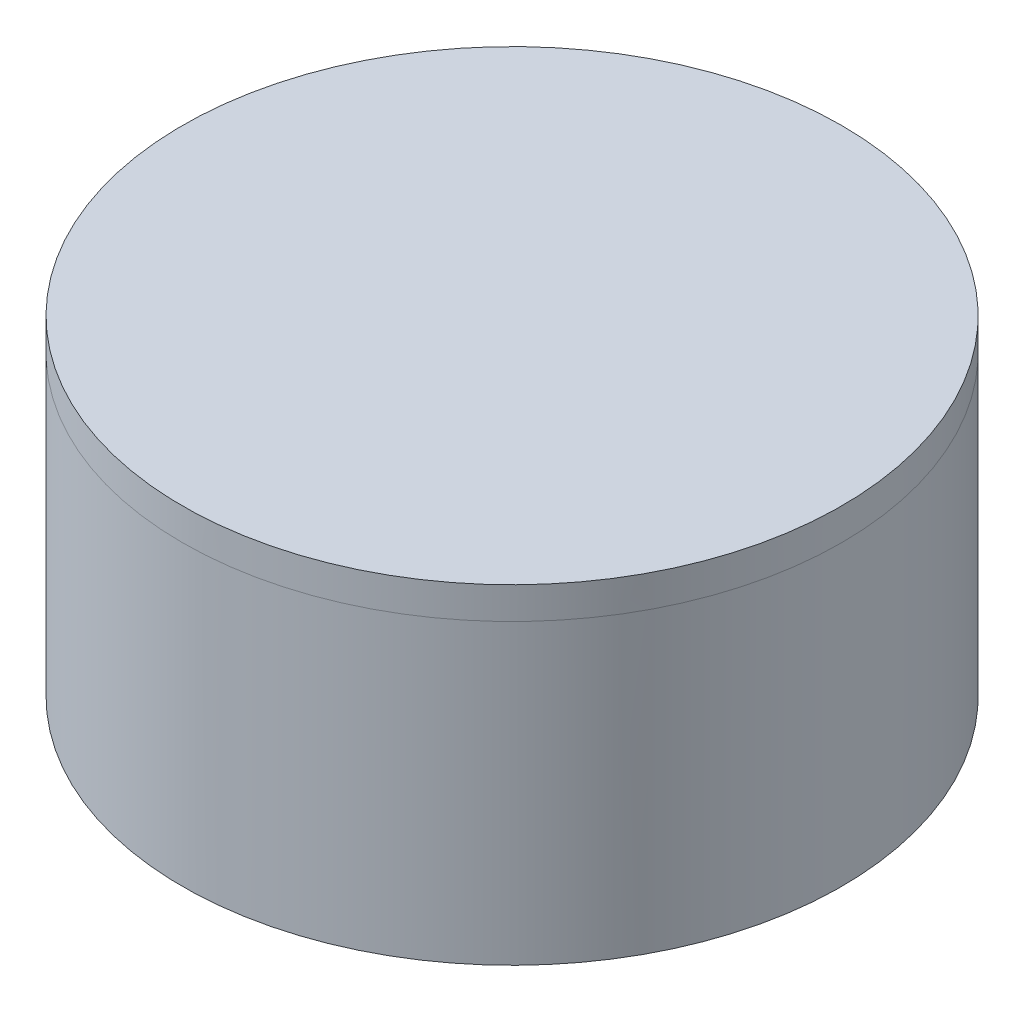
ISO-10303-21;
HEADER;
FILE_DESCRIPTION(('STEP AP214'),'2;1');
FILE_NAME('part.step','',(''),(''),'','','');
FILE_SCHEMA(('AUTOMOTIVE_DESIGN { 1 0 10303 214 1 1 1 1 }'));
ENDSEC;
DATA;
#1=APPLICATION_CONTEXT('core data for automotive mechanical design processes');
#2=APPLICATION_PROTOCOL_DEFINITION('international standard','automotive_design',2000,#1);
#3=PRODUCT_CONTEXT('',#1,'mechanical');
#4=PRODUCT('Part','Part','',(#3));
#5=PRODUCT_RELATED_PRODUCT_CATEGORY('part','',(#4));
#6=PRODUCT_DEFINITION_FORMATION('','',#4);
#7=PRODUCT_DEFINITION_CONTEXT('part definition',#1,'design');
#8=PRODUCT_DEFINITION('design','',#6,#7);
#9=PRODUCT_DEFINITION_SHAPE('','',#8);
#10=(LENGTH_UNIT() NAMED_UNIT(*) SI_UNIT(.MILLI.,.METRE.));
#11=(NAMED_UNIT(*) PLANE_ANGLE_UNIT() SI_UNIT($,.RADIAN.));
#12=(NAMED_UNIT(*) SI_UNIT($,.STERADIAN.) SOLID_ANGLE_UNIT());
#13=UNCERTAINTY_MEASURE_WITH_UNIT(LENGTH_MEASURE(1.E-05),#10,'distance_accuracy_value','');
#14=(GEOMETRIC_REPRESENTATION_CONTEXT(3) GLOBAL_UNCERTAINTY_ASSIGNED_CONTEXT((#13)) GLOBAL_UNIT_ASSIGNED_CONTEXT((#10,
#11,#12)) REPRESENTATION_CONTEXT('',''));
#15=CARTESIAN_POINT('',(0.,0.,0.));
#16=DIRECTION('',(0.,0.,1.));
#17=DIRECTION('',(1.,0.,0.));
#18=AXIS2_PLACEMENT_3D('',#15,#16,#17);
#19=CARTESIAN_POINT('',(0.,29.7711569371554,0.));
#20=DIRECTION('',(0.,1.,0.));
#21=DIRECTION('',(0.,0.,1.));
#22=AXIS2_PLACEMENT_3D('',#19,#20,#21);
#23=PLANE('',#22);
#24=CARTESIAN_POINT('',(0.,29.7711569371554,0.));
#25=DIRECTION('',(0.,1.,0.));
#26=DIRECTION('',(0.00319420156689542,0.,0.999994898525163));
#27=AXIS2_PLACEMENT_3D('',#24,#25,#26);
#28=CIRCLE('',#27,71.2513108531376);
#29=CARTESIAN_POINT('',(0.227591048770443,29.7711569371554,71.2509473663682));
#30=VERTEX_POINT('',#29);
#31=EDGE_CURVE('E46',#30,#30,#28,.T.);
#32=ORIENTED_EDGE('',*,*,#31,.T.);
#33=EDGE_LOOP('',(#32));
#34=FACE_BOUND('',#33,.T.);
#35=CARTESIAN_POINT('',(0.,29.7711569371554,0.));
#36=DIRECTION('',(0.,1.,0.));
#37=DIRECTION('',(0.00319420156689542,0.,0.999994898525163));
#38=AXIS2_PLACEMENT_3D('',#35,#36,#37);
#39=CIRCLE('',#38,8.07840908288413);
#40=CARTESIAN_POINT('',(0.0258040669505688,29.7711569371554,8.07836787108347));
#41=VERTEX_POINT('',#40);
#42=EDGE_CURVE('E133',#41,#41,#39,.T.);
#43=ORIENTED_EDGE('',*,*,#42,.F.);
#44=EDGE_LOOP('',(#43));
#45=FACE_BOUND('',#44,.T.);
#46=ADVANCED_FACE('F43',(#34,#45),#23,.T.);
#47=CARTESIAN_POINT('',(0.,27.0387174281487,0.));
#48=DIRECTION('',(0.,1.,0.));
#49=DIRECTION('',(0.00319420156689542,0.,0.999994898525163));
#50=AXIS2_PLACEMENT_3D('',#47,#48,#49);
#51=CONICAL_SURFACE('',#50,71.1662591192297,0.0311166199937539);
#52=ORIENTED_EDGE('',*,*,#31,.F.);
#53=EDGE_LOOP('',(#52));
#54=FACE_BOUND('',#53,.T.);
#55=CARTESIAN_POINT('',(0.,27.0387174281487,0.));
#56=DIRECTION('',(0.,1.,0.));
#57=DIRECTION('',(0.00319420156689542,0.,0.999994898525163));
#58=AXIS2_PLACEMENT_3D('',#55,#56,#57);
#59=CIRCLE('',#58,71.1662591192297);
#60=CARTESIAN_POINT('',(0.227319376388727,27.0387174281486,71.1658960663496));
#61=VERTEX_POINT('',#60);
#62=EDGE_CURVE('E175',#61,#61,#59,.T.);
#63=ORIENTED_EDGE('',*,*,#62,.T.);
#64=EDGE_LOOP('',(#63));
#65=FACE_BOUND('',#64,.T.);
#66=ADVANCED_FACE('F222',(#54,#65),#51,.T.);
#67=CARTESIAN_POINT('',(0.,-30.6071588454176,0.));
#68=DIRECTION('',(0.,1.,0.));
#69=DIRECTION('',(0.00319420156689542,0.,0.999994898525163));
#70=AXIS2_PLACEMENT_3D('',#67,#68,#69);
#71=CONICAL_SURFACE('',#70,55.5585716287928,0.264411817054796);
#72=ORIENTED_EDGE('',*,*,#62,.F.);
#73=EDGE_LOOP('',(#72));
#74=FACE_BOUND('',#73,.T.);
#75=CARTESIAN_POINT('',(0.,-30.6071588454176,0.));
#76=DIRECTION('',(0.,1.,0.));
#77=DIRECTION('',(0.00319420156689542,0.,0.999994898525163));
#78=AXIS2_PLACEMENT_3D('',#75,#76,#77);
#79=CIRCLE('',#78,55.5585716287928);
#80=CARTESIAN_POINT('',(0.177465276551159,-30.6071588454176,55.5582881981376));
#81=VERTEX_POINT('',#80);
#82=EDGE_CURVE('E178',#81,#81,#79,.T.);
#83=ORIENTED_EDGE('',*,*,#82,.T.);
#84=EDGE_LOOP('',(#83));
#85=FACE_BOUND('',#84,.T.);
#86=ADVANCED_FACE('F227',(#74,#85),#71,.T.);
#87=CARTESIAN_POINT('',(0.,-29.8231341296344,0.));
#88=DIRECTION('',(0.,1.,0.));
#89=DIRECTION('',(0.00319420156689542,0.,0.999994898525163));
#90=AXIS2_PLACEMENT_3D('',#87,#88,#89);
#91=TOROIDAL_SURFACE('',#90,52.6628324753052,3.00000000000001);
#92=ORIENTED_EDGE('',*,*,#82,.F.);
#93=EDGE_LOOP('',(#92));
#94=FACE_BOUND('',#93,.T.);
#95=CARTESIAN_POINT('',(0.,-31.3354457386129,0.));
#96=DIRECTION('',(0.,1.,0.));
#97=DIRECTION('',(0.00319420156689542,0.,0.999994898525163));
#98=AXIS2_PLACEMENT_3D('',#95,#96,#97);
#99=CIRCLE('',#98,50.0719033760536);
#100=CARTESIAN_POINT('',(0.159939752221224,-31.3354457386129,50.0716479354984));
#101=VERTEX_POINT('',#100);
#102=EDGE_CURVE('E181',#101,#101,#99,.T.);
#103=ORIENTED_EDGE('',*,*,#102,.T.);
#104=EDGE_LOOP('',(#103));
#105=FACE_BOUND('',#104,.T.);
#106=ADVANCED_FACE('F237',(#94,#105),#91,.T.);
#107=CARTESIAN_POINT('',(0.,11.988680900437,0.));
#108=DIRECTION('',(0.,-1.,0.));
#109=DIRECTION('',(-0.00319420156689542,0.,-0.999994898525163));
#110=AXIS2_PLACEMENT_3D('',#107,#108,#109);
#111=CONICAL_SURFACE('',#110,24.7838398454789,0.52834403413605);
#112=CARTESIAN_POINT('',(-0.0446827722450191,-15.8939814353622,-13.9886426580156));
#113=DIRECTION('',(-0.00161020937034462,0.863643033083877,-0.504101297986293));
#114=DIRECTION('',(-0.00275864992951517,-0.5041038696595,-0.863638627230675));
#115=AXIS2_PLACEMENT_3D('',#112,#113,#114);
#116=ELLIPSE('',#115,47.5414040016155,38.6023461770421);
#117=CARTESIAN_POINT('',(7.58392991259792,7.61514125969301,26.2635972130715));
#118=VERTEX_POINT('',#117);
#119=CARTESIAN_POINT('',(-7.41599356527952,7.615141259693,26.311510236575));
#120=VERTEX_POINT('',#119);
#121=EDGE_CURVE('E137',#118,#120,#116,.F.);
#122=ORIENTED_EDGE('',*,*,#121,.T.);
#123=CARTESIAN_POINT('',(-7.46638926393674,32.3278275727116,10.5343463634101));
#124=CARTESIAN_POINT('',(-7.46572259211304,32.036733598928,10.7430584339327));
#125=CARTESIAN_POINT('',(-7.46506026857972,31.7446683378845,10.9504092039507));
#126=CARTESIAN_POINT('',(-7.46374328874539,31.1588556454148,11.3627103966627));
#127=CARTESIAN_POINT('',(-7.46308863230584,30.8651082445254,11.5676608627263));
#128=CARTESIAN_POINT('',(-7.46178597966072,30.2762021007259,11.9754767041479));
#129=CARTESIAN_POINT('',(-7.46113798298398,29.9810434598536,12.1783422270117));
#130=CARTESIAN_POINT('',(-7.45984779080229,29.3894846610793,12.5822571249235));
#131=CARTESIAN_POINT('',(-7.45920559532756,29.0930844967223,12.7833064905115));
#132=CARTESIAN_POINT('',(-7.45728689732305,28.2023927225672,13.3839849937731));
#133=CARTESIAN_POINT('',(-7.45601802038707,27.6064906022309,13.7812268197094));
#134=CARTESIAN_POINT('',(-7.4534962446907,26.4113707901848,14.5707082531059));
#135=CARTESIAN_POINT('',(-7.45224334627392,25.8121530275719,14.9629477529971));
#136=CARTESIAN_POINT('',(-7.44975081510409,24.6112953085614,15.7432737286912));
#137=CARTESIAN_POINT('',(-7.44851117821731,24.0096561924561,16.1313614986213));
#138=CARTESIAN_POINT('',(-7.44604240334923,22.8042787605777,16.9042501914553));
#139=CARTESIAN_POINT('',(-7.44481326528807,22.2005404608202,17.2890511393588));
#140=CARTESIAN_POINT('',(-7.44236358567693,20.99130419071,18.0559617625184));
#141=CARTESIAN_POINT('',(-7.44114304467728,20.385806111148,18.4380712654824));
#142=CARTESIAN_POINT('',(-7.43870923105758,19.1733794728724,19.2000147911776));
#143=CARTESIAN_POINT('',(-7.43749595844861,18.5664509119795,19.5798488104393));
#144=CARTESIAN_POINT('',(-7.43394818984154,16.785480473313,20.690533416252));
#145=CARTESIAN_POINT('',(-7.43162204024426,15.6098090253431,21.4187710311213));
#146=CARTESIAN_POINT('',(-7.42698660625516,13.2552130005653,22.8699663437755));
#147=CARTESIAN_POINT('',(-7.42467732190231,12.0762884162486,23.5929240293593));
#148=CARTESIAN_POINT('',(-7.42007170224228,9.71599408781002,25.0347854986887));
#149=CARTESIAN_POINT('',(-7.41777536669485,8.53462438961337,25.7536893576473));
#150=CARTESIAN_POINT('',(-7.41319277371603,6.16997070295588,27.1883419632725));
#151=CARTESIAN_POINT('',(-7.41090651629139,4.98668671321432,27.9040907078269));
#152=CARTESIAN_POINT('',(-7.40634136479708,2.61825862660785,29.3332829831714));
#153=CARTESIAN_POINT('',(-7.40406247306109,1.43311408901331,30.0467257833697));
#154=CARTESIAN_POINT('',(-7.39951120311719,-0.938400088100074,31.4715722216384));
#155=CARTESIAN_POINT('',(-7.39723882491056,-2.12476972785604,32.1829758593139));
#156=CARTESIAN_POINT('',(-7.39042963772773,-5.68537353134732,34.3146987025121));
#157=CARTESIAN_POINT('',(-7.38590078369019,-8.06109868143304,35.7325274897225));
#158=CARTESIAN_POINT('',(-7.37794898892542,-12.2416471215491,38.2219615571587));
#159=CARTESIAN_POINT('',(-7.37452291363112,-14.0458865793192,39.294548162769));
#160=CARTESIAN_POINT('',(-7.36767748272005,-17.6556148218869,41.4376176735391));
#161=CARTESIAN_POINT('',(-7.36425812710433,-19.4611036068761,42.5081005783764));
#162=CARTESIAN_POINT('',(-7.35400799974161,-24.8790404204683,45.7170637127585));
#163=CARTESIAN_POINT('',(-7.34718516532595,-28.492960041022,47.8530590362375));
#164=CARTESIAN_POINT('',(-7.33355726747278,-35.7213857451937,52.1194861997667));
#165=CARTESIAN_POINT('',(-7.32675219629385,-39.3358903990791,54.2499204633908));
#166=CARTESIAN_POINT('',(-7.31655199315244,-44.7590077425873,57.443254037276));
#167=CARTESIAN_POINT('',(-7.31315316228462,-46.566938701678,58.5073113478716));
#168=CARTESIAN_POINT('',(-7.30635761931728,-50.1831905950564,60.6347626554153));
#169=CARTESIAN_POINT('',(-7.30296090721753,-51.9915115293013,61.6981566524361));
#170=CARTESIAN_POINT('',(-7.29956508055026,-53.7999953946334,62.7612734509286));
#171=B_SPLINE_CURVE_WITH_KNOTS('',3,(#123,#124,#125,#126,#127,#128,#129,#130,#131,#132,#133,
#134,#135,#136,#137,#138,#139,#140,#141,#142,#143,#144,#145,#146,#147,#148,#149,#150,#151,#152,
#153,#154,#155,#156,#157,#158,#159,#160,#161,#162,#163,#164,#165,#166,#167,#168,#169,#170),
.UNSPECIFIED.,.F.,.F.,(4,2,2,2,2,2,2,2,2,2,2,2,2,2,2,2,2,2,2,2,2,2,2,4),(0.,1.07454705731892,
2.14907466928079,3.22352572980844,4.29798238376901,6.44646112025147,8.59498597962801,
10.742820378726,12.8906384267248,15.038592739387,17.1865503263568,21.3353657569929,
25.4841907718652,29.6329385562692,33.7816891174998,37.931645691019,42.0816030679257,
50.3815314737758,56.6784822099514,62.9754339115513,75.5693333588582,88.1562676949951,
94.4497240815708,100.743179777603),.UNSPECIFIED.);
#172=CARTESIAN_POINT('',(-7.35050909132089,-26.7339383160999,46.8124518709093));
#173=VERTEX_POINT('',#172);
#174=EDGE_CURVE('E139',#120,#173,#171,.T.);
#175=ORIENTED_EDGE('',*,*,#174,.T.);
#176=CARTESIAN_POINT('',(-0.0779663849513403,-68.2915180313687,-24.4085996374881));
#177=DIRECTION('',(0.00161020937034442,-0.863643033083877,0.504101297986293));
#178=DIRECTION('',(-0.00275864992951483,-0.5041038696595,-0.863638627230675));
#179=AXIS2_PLACEMENT_3D('',#176,#177,#178);
#180=ELLIPSE('',#179,82.9543741196778,67.3567290221141);
#181=CARTESIAN_POINT('',(7.64941438655655,-26.7339383160999,46.7645388474059));
#182=VERTEX_POINT('',#181);
#183=EDGE_CURVE('E383',#173,#182,#180,.F.);
#184=ORIENTED_EDGE('',*,*,#183,.T.);
#185=CARTESIAN_POINT('',(7.70035839732717,-53.7999953946333,62.7133604274252));
#186=CARTESIAN_POINT('',(7.69696134105946,-51.9908543658379,61.6498586832266));
#187=CARTESIAN_POINT('',(7.69356339393183,-50.1818773285697,60.5860780413579));
#188=CARTESIAN_POINT('',(7.68676537997122,-46.564313924007,58.4578531506187));
#189=CARTESIAN_POINT('',(7.68336531313848,-44.7557275566717,57.3934089018179));
#190=CARTESIAN_POINT('',(7.67316165140723,-39.3307682754064,54.198992562139));
#191=CARTESIAN_POINT('',(7.66635436923259,-35.7150747680609,52.0678661116309));
#192=CARTESIAN_POINT('',(7.65613332361307,-30.2937360920853,48.8680074730771));
#193=CARTESIAN_POINT('',(7.65272485331372,-28.4871128253971,47.8009323872555));
#194=CARTESIAN_POINT('',(7.64590358480121,-24.8746685197854,45.6654272943187));
#195=CARTESIAN_POINT('',(7.64249078659049,-23.0688474804132,44.5969972879627));
#196=CARTESIAN_POINT('',(7.63565974624331,-19.4581358919363,42.4584329689182));
#197=CARTESIAN_POINT('',(7.63224150393451,-17.6532453747848,41.3882986022732));
#198=CARTESIAN_POINT('',(7.62539831988576,-14.0447042250797,39.2459325069907));
#199=CARTESIAN_POINT('',(7.62197337813189,-12.2410535951148,38.1737007739925));
#200=CARTESIAN_POINT('',(7.61511406774907,-8.6348830859475,36.0262860769016));
#201=CARTESIAN_POINT('',(7.61167969692829,-6.83236361522516,34.9511024266243));
#202=CARTESIAN_POINT('',(7.60479980001204,-3.22942947438728,32.7972427923631));
#203=CARTESIAN_POINT('',(7.60135427399712,-1.42901478919851,31.7185668336003));
#204=CARTESIAN_POINT('',(7.59444855809601,2.16884613144807,29.5566241611834));
#205=CARTESIAN_POINT('',(7.59098836950862,3.96629261100404,28.4733578541365));
#206=CARTESIAN_POINT('',(7.5857824024376,6.65952418696156,26.8435482119215));
#207=CARTESIAN_POINT('',(7.58404444241475,7.55679048210649,26.2994525685204));
#208=CARTESIAN_POINT('',(7.58056224560982,9.35012828676411,25.2092962437994));
#209=CARTESIAN_POINT('',(7.57881800883118,10.2461997969287,24.6632355635523));
#210=CARTESIAN_POINT('',(7.57532142994222,12.0371593356327,23.568576701856));
#211=CARTESIAN_POINT('',(7.5735690855688,12.9320469312827,23.0199778119039));
#212=CARTESIAN_POINT('',(7.57005509499915,14.7200268511261,21.9198679504821));
#213=CARTESIAN_POINT('',(7.56829344883668,15.6131191818159,21.3683569895766));
#214=CARTESIAN_POINT('',(7.56475869868732,17.3969866835903,20.2617480161311));
#215=CARTESIAN_POINT('',(7.56298559557665,18.2877620247364,19.7066502779049));
#216=CARTESIAN_POINT('',(7.55942467286952,20.0664454219084,18.5918475747576));
#217=CARTESIAN_POINT('',(7.55763685306927,20.9543534379912,18.0321425460372));
#218=CARTESIAN_POINT('',(7.55404156044226,22.7266883734212,16.9065798004138));
#219=CARTESIAN_POINT('',(7.55223408113886,23.6111140062654,16.3407200558918));
#220=CARTESIAN_POINT('',(7.54859391211966,25.3748332905222,15.2011080518503));
#221=CARTESIAN_POINT('',(7.54676122337766,26.2541271383067,14.6273560971903));
#222=CARTESIAN_POINT('',(7.54398580937997,27.5677755381466,13.7584692154892));
#223=CARTESIAN_POINT('',(7.54305614742101,28.0048348570036,13.4674239583747));
#224=CARTESIAN_POINT('',(7.54118639373064,28.8767559380193,12.882068240297));
#225=CARTESIAN_POINT('',(7.54024630212382,29.3116177263407,12.5877578183414));
#226=CARTESIAN_POINT('',(7.53835345838616,30.1787195492192,11.9951733988161));
#227=CARTESIAN_POINT('',(7.53740070464049,30.6109592389352,11.6968988956983));
#228=CARTESIAN_POINT('',(7.53596007748175,31.2568179149244,11.2458879687927));
#229=CARTESIAN_POINT('',(7.53547794216304,31.4716917860184,11.0949479454359));
#230=CARTESIAN_POINT('',(7.53450939553381,31.9004954927652,10.7917292324241));
#231=CARTESIAN_POINT('',(7.53402298418601,32.1144253201625,10.6394505310973));
#232=CARTESIAN_POINT('',(7.5335342139407,32.3278275727116,10.4864333399067));
#233=B_SPLINE_CURVE_WITH_KNOTS('',3,(#185,#186,#187,#188,#189,#190,#191,#192,#193,#194,#195,
#196,#197,#198,#199,#200,#201,#202,#203,#204,#205,#206,#207,#208,#209,#210,#211,#212,#213,#214,
#215,#216,#217,#218,#219,#220,#221,#222,#223,#224,#225,#226,#227,#228,#229,#230,#231,#232),
.UNSPECIFIED.,.F.,.F.,(4,2,2,2,2,2,2,2,2,2,2,2,2,2,2,2,2,2,2,2,2,2,2,4),(0.,6.29574041454672,
12.5914801697311,25.1825406724665,31.4772154715609,37.7718867459694,44.0667614241697,
50.361649204559,56.6581509382567,62.9546073004991,69.2505171268053,72.3985572757143,
75.5465957062367,78.6955734194489,81.8445397169774,84.9932679692361,88.1420398969512,
91.2918826290948,94.4416040292236,96.0168896445208,97.5921564608361,99.1676261399107,
99.9553938409751,100.74316841733),.UNSPECIFIED.);
#234=EDGE_CURVE('E385',#182,#118,#233,.T.);
#235=ORIENTED_EDGE('',*,*,#234,.T.);
#236=EDGE_LOOP('',(#122,#175,#184,#235));
#237=FACE_BOUND('',#236,.T.);
#238=CARTESIAN_POINT('',(0.0446827722450151,-15.8939814353622,13.9886426580155));
#239=DIRECTION('',(0.00161020937034462,0.863643033083876,0.504101297986294));
#240=DIRECTION('',(0.00275864992951517,-0.504103869659501,0.863638627230674));
#241=AXIS2_PLACEMENT_3D('',#238,#239,#240);
#242=ELLIPSE('',#241,47.5414040016155,38.6023461770421);
#243=CARTESIAN_POINT('',(-7.58392991259792,7.61514125969305,-26.2635972130716));
#244=VERTEX_POINT('',#243);
#245=CARTESIAN_POINT('',(7.41599356527952,7.61514125969304,-26.311510236575));
#246=VERTEX_POINT('',#245);
#247=EDGE_CURVE('E173',#244,#246,#242,.F.);
#248=ORIENTED_EDGE('',*,*,#247,.T.);
#249=CARTESIAN_POINT('',(7.45854326919482,28.7856207773834,-12.9906580743218));
#250=CARTESIAN_POINT('',(7.45780178748034,28.4413423487081,-13.2227905544715));
#251=CARTESIAN_POINT('',(7.45706368247411,28.0963533724322,-13.4538659031456));
#252=CARTESIAN_POINT('',(7.45559345327695,27.4051320884686,-13.9141442124603));
#253=CARTESIAN_POINT('',(7.45486132904035,27.0588997903052,-14.1433471874005));
#254=CARTESIAN_POINT('',(7.45340230019347,26.3653751592315,-14.6001190513951));
#255=CARTESIAN_POINT('',(7.45267539542131,26.0180828596768,-14.8276879911283));
#256=CARTESIAN_POINT('',(7.45122616956341,25.3225615018386,-15.2813908756705));
#257=CARTESIAN_POINT('',(7.45050384848773,24.9743324415001,-15.5075248173278));
#258=CARTESIAN_POINT('',(7.44834307839724,23.9284821918052,-16.1839877837781));
#259=CARTESIAN_POINT('',(7.446910687999,23.2296338482776,-16.6324200636243));
#260=CARTESIAN_POINT('',(7.44405871901711,21.8293741533729,-17.5252736838226));
#261=CARTESIAN_POINT('',(7.44263914055384,21.1279627779982,-17.9696949864843));
#262=CARTESIAN_POINT('',(7.43981057991826,19.7232008244657,-18.855220256731));
#263=CARTESIAN_POINT('',(7.43840159614997,19.0198505611166,-19.2963247239623));
#264=CARTESIAN_POINT('',(7.43559216287445,17.611485849686,-20.1758618741493));
#265=CARTESIAN_POINT('',(7.43419171333895,16.9064714071279,-20.6142945659553));
#266=CARTESIAN_POINT('',(7.43000084212322,14.7893398219414,-21.9263125298598));
#267=CARTESIAN_POINT('',(7.42722097818103,13.3751744509581,-22.7965925364796));
#268=CARTESIAN_POINT('',(7.42173530788537,10.5706421166325,-24.513967660049));
#269=CARTESIAN_POINT('',(7.41902911482785,9.18034916342261,-25.3611838407655));
#270=CARTESIAN_POINT('',(7.41363108650384,6.39703283885336,-27.0511212705289));
#271=CARTESIAN_POINT('',(7.4109392512553,5.00400946408298,-27.8938425139556));
#272=CARTESIAN_POINT('',(7.40556657299105,2.21590212900973,-29.5758437099203));
#273=CARTESIAN_POINT('',(7.40288572989272,0.820818184300976,-30.4151236883217));
#274=CARTESIAN_POINT('',(7.39753262961228,-1.970961690782,-32.0909956893907));
#275=CARTESIAN_POINT('',(7.39486037242531,-3.3676576202437,-32.9275877135789));
#276=CARTESIAN_POINT('',(7.38952231412282,-6.16252936975357,-34.598750587533));
#277=CARTESIAN_POINT('',(7.3868565139867,-7.56070537309584,-35.4333211306806));
#278=CARTESIAN_POINT('',(7.38153046419649,-10.3580932668162,-37.100724551523));
#279=CARTESIAN_POINT('',(7.37887021454344,-11.7573051573885,-37.933557428892));
#280=CARTESIAN_POINT('',(7.3708962436519,-15.9562048006787,-40.4299340806234));
#281=CARTESIAN_POINT('',(7.36558930385662,-18.7571547556267,-42.0913548178318));
#282=CARTESIAN_POINT('',(7.35628729504048,-23.6745442257557,-45.0034945708698));
#283=CARTESIAN_POINT('',(7.35228951664062,-25.7904817456712,-46.2550618002912));
#284=CARTESIAN_POINT('',(7.34429964349044,-30.0234069943351,-48.7564169035038));
#285=CARTESIAN_POINT('',(7.3403075487376,-32.1403947226167,-50.006204778085));
#286=CARTESIAN_POINT('',(7.32833798080483,-38.4925998815765,-53.753465750706));
#287=CARTESIAN_POINT('',(7.32036722632445,-42.7290580304278,-56.2488354544805));
#288=CARTESIAN_POINT('',(7.30443977562508,-51.2029969694246,-61.2351737028089));
#289=CARTESIAN_POINT('',(7.29648307614706,-55.4404771594186,-63.7261432676518));
#290=CARTESIAN_POINT('',(7.28455431328467,-61.7978501638441,-67.4606295730067));
#291=CARTESIAN_POINT('',(7.28057910894314,-63.9171654336526,-68.7051296394147));
#292=CARTESIAN_POINT('',(7.27263049980428,-68.1561266917078,-71.1935663966959));
#293=CARTESIAN_POINT('',(7.26865709500694,-70.2757726799529,-72.4375030875719));
#294=CARTESIAN_POINT('',(7.26468444275167,-72.3955568827459,-73.6812041833486));
#295=B_SPLINE_CURVE_WITH_KNOTS('',3,(#249,#250,#251,#252,#253,#254,#255,#256,#257,#258,#259,
#260,#261,#262,#263,#264,#265,#266,#267,#268,#269,#270,#271,#272,#273,#274,#275,#276,#277,#278,
#279,#280,#281,#282,#283,#284,#285,#286,#287,#288,#289,#290,#291,#292,#293,#294),.UNSPECIFIED.,
.F.,.F.,(4,2,2,2,2,2,2,2,2,2,2,2,2,2,2,2,2,2,2,2,2,2,4),(0.,1.24567711316934,2.4913447041401,
3.7369734930017,4.98260501663594,7.4736380162883,9.96469439936311,12.4553676950206,
14.946032735852,19.9275046439698,24.8117834292804,29.6960683202439,34.5803164350571,
39.4645617863055,44.3495066281484,49.2344523862877,59.0043500852961,66.3794868230841,
73.754620285679,88.5048915888685,103.251112981384,110.624215435309,117.997317853016),.UNSPECIFIED.);
#296=CARTESIAN_POINT('',(7.35050909132089,-26.7339383160998,-46.8124518709094));
#297=VERTEX_POINT('',#296);
#298=EDGE_CURVE('E120',#246,#297,#295,.T.);
#299=ORIENTED_EDGE('',*,*,#298,.T.);
#300=CARTESIAN_POINT('',(0.0779663849513363,-68.2915180313688,24.408599637488));
#301=DIRECTION('',(-0.00161020937034442,-0.863643033083876,-0.504101297986294));
#302=DIRECTION('',(0.00275864992951483,-0.504103869659501,0.863638627230675));
#303=AXIS2_PLACEMENT_3D('',#300,#301,#302);
#304=ELLIPSE('',#303,82.9543741196779,67.3567290221141);
#305=CARTESIAN_POINT('',(-7.64941438655655,-26.7339383160998,-46.764538847406));
#306=VERTEX_POINT('',#305);
#307=EDGE_CURVE('E112',#297,#306,#304,.F.);
#308=ORIENTED_EDGE('',*,*,#307,.T.);
#309=CARTESIAN_POINT('',(-7.73523903512576,-72.3955568827459,-73.6332911598452));
#310=CARTESIAN_POINT('',(-7.73126566895538,-70.2753897866742,-72.3893665617456));
#311=CARTESIAN_POINT('',(-7.7272915459408,-68.155361732975,-71.1452050216956));
#312=CARTESIAN_POINT('',(-7.71934149986316,-63.9156365789537,-68.6563184081945));
#313=CARTESIAN_POINT('',(-7.7153655768002,-61.7959394786168,-67.4115933347686));
#314=CARTESIAN_POINT('',(-7.70343480675363,-55.4374925296049,-63.6764786489261));
#315=CARTESIAN_POINT('',(-7.69547682975681,-51.1993181028618,-61.1851091367861));
#316=CARTESIAN_POINT('',(-7.68353115951439,-44.843853877053,-57.445329710939));
#317=CARTESIAN_POINT('',(-7.67954795413692,-42.7257373124891,-56.1983247947391));
#318=CARTESIAN_POINT('',(-7.67157787557897,-38.4901813149161,-53.7031666990854));
#319=CARTESIAN_POINT('',(-7.66759100239947,-36.3727418817282,-52.455013519935));
#320=CARTESIAN_POINT('',(-7.65961267706516,-32.1386633889771,-49.9572736415975));
#321=CARTESIAN_POINT('',(-7.65562122483882,-30.0220243426225,-48.7076869200177));
#322=CARTESIAN_POINT('',(-7.64763265711089,-25.7897909870802,-46.2067404997149));
#323=CARTESIAN_POINT('',(-7.64363554160373,-23.6741966789237,-44.9553807992469));
#324=CARTESIAN_POINT('',(-7.63563358066547,-19.4440782340277,-42.4502414243909));
#325=CARTESIAN_POINT('',(-7.63162873431728,-17.3295542672898,-41.196461462892));
#326=CARTESIAN_POINT('',(-7.62360963815479,-13.1022637902455,-38.6859576373403));
#327=CARTESIAN_POINT('',(-7.6195953883725,-10.9894972739871,-37.429233783313));
#328=CARTESIAN_POINT('',(-7.61155444057869,-6.76640751160855,-34.9118889618548));
#329=CARTESIAN_POINT('',(-7.60752774310006,-4.65608416606915,-33.6512681612538));
#330=CARTESIAN_POINT('',(-7.59945691769178,-0.438667806227791,-31.1245696839863));
#331=CARTESIAN_POINT('',(-7.59541278954668,1.66842516770404,-29.8584919398656));
#332=CARTESIAN_POINT('',(-7.58932741975243,4.82565201206726,-27.9533714825461));
#333=CARTESIAN_POINT('',(-7.5872956176675,5.87756896020077,-27.3172839729788));
#334=CARTESIAN_POINT('',(-7.58322425084215,7.97992773445903,-26.0426787327953));
#335=CARTESIAN_POINT('',(-7.58118468611442,9.03036956298946,-25.4041610061489));
#336=CARTESIAN_POINT('',(-7.57709600582221,11.1293793602425,-24.1241355136162));
#337=CARTESIAN_POINT('',(-7.57504689060027,12.1779473943332,-23.4826278549676));
#338=CARTESIAN_POINT('',(-7.57093649015734,14.2727538195189,-22.1958025285945));
#339=CARTESIAN_POINT('',(-7.56887520486,15.3189921959408,-21.5504848369659));
#340=CARTESIAN_POINT('',(-7.56473661602581,17.4085981392645,-20.2548346926003));
#341=CARTESIAN_POINT('',(-7.56265930992359,18.4519652085075,-19.6045014367323));
#342=CARTESIAN_POINT('',(-7.55848404762115,20.5346249875155,-18.297370087942));
#343=CARTESIAN_POINT('',(-7.55638609178288,21.57391776825,-17.6405721083339));
#344=CARTESIAN_POINT('',(-7.55321781468182,23.1286865557468,-16.6486932704379));
#345=CARTESIAN_POINT('',(-7.55215809740901,23.6462803503585,-16.3169321575297));
#346=CARTESIAN_POINT('',(-7.55003023355635,24.6797641088256,-15.650771004936));
#347=CARTESIAN_POINT('',(-7.5489620870206,25.1956540815763,-15.3163709790586));
#348=CARTESIAN_POINT('',(-7.54681569409124,26.2254164438291,-14.6444090083958));
#349=CARTESIAN_POINT('',(-7.5457374471114,26.7392887137341,-14.3068468800785));
#350=CARTESIAN_POINT('',(-7.54356863101403,27.7644903663678,-13.6278649849852));
#351=CARTESIAN_POINT('',(-7.54247806167423,28.2758197029822,-13.286445148617));
#352=CARTESIAN_POINT('',(-7.54138020868263,28.7856207773834,-12.9427450508184));
#353=B_SPLINE_CURVE_WITH_KNOTS('',3,(#309,#310,#311,#312,#313,#314,#315,#316,#317,#318,#319,
#320,#321,#322,#323,#324,#325,#326,#327,#328,#329,#330,#331,#332,#333,#334,#335,#336,#337,#338,
#339,#340,#341,#342,#343,#344,#345,#346,#347,#348,#349,#350,#351,#352),.UNSPECIFIED.,.F.,.F.,(4,
2,2,2,2,2,2,2,2,2,2,2,2,2,2,2,2,2,2,2,2,4),(0.,7.37443240573748,14.7488644797392,
29.4974888849325,36.8712999901873,44.2451091477756,51.6190351015148,58.9929683185535,
66.3678378757232,73.7426823538841,81.1172153672541,88.4918398013258,92.1796912151583,
95.8675366076608,99.5552507335284,103.242988020724,106.931328612409,110.619604669315,
112.463975955086,114.308337596556,116.152806958361,117.997309647201),.UNSPECIFIED.);
#354=EDGE_CURVE('E117',#306,#244,#353,.T.);
#355=ORIENTED_EDGE('',*,*,#354,.T.);
#356=EDGE_LOOP('',(#248,#299,#308,#355));
#357=FACE_BOUND('',#356,.T.);
#358=ORIENTED_EDGE('',*,*,#102,.F.);
#359=EDGE_LOOP('',(#358));
#360=FACE_BOUND('',#359,.T.);
#361=CARTESIAN_POINT('',(0.,11.988680900437,0.));
#362=DIRECTION('',(0.,1.,0.));
#363=DIRECTION('',(0.00319420156689542,0.,0.999994898525163));
#364=AXIS2_PLACEMENT_3D('',#361,#362,#363);
#365=CIRCLE('',#364,24.7838398454789);
#366=CARTESIAN_POINT('',(0.079164580068112,11.9886809004369,24.7837134113436));
#367=VERTEX_POINT('',#366);
#368=EDGE_CURVE('E184',#367,#367,#365,.T.);
#369=ORIENTED_EDGE('',*,*,#368,.T.);
#370=EDGE_LOOP('',(#369));
#371=FACE_BOUND('',#370,.T.);
#372=ADVANCED_FACE('F114',(#237,#357,#360,#371),#111,.F.);
#373=CARTESIAN_POINT('',(0.,0.167734136618606,0.));
#374=DIRECTION('',(0.,1.,0.));
#375=DIRECTION('',(0.00319420156689542,0.,0.999994898525163));
#376=AXIS2_PLACEMENT_3D('',#373,#374,#375);
#377=DEGENERATE_TOROIDAL_SURFACE('',#376,4.53190580672045,23.4494267457277,.T.);
#378=ORIENTED_EDGE('',*,*,#368,.F.);
#379=EDGE_LOOP('',(#378));
#380=FACE_BOUND('',#379,.T.);
#381=CARTESIAN_POINT('',(0.,23.3474219950737,0.));
#382=DIRECTION('',(0.,1.,0.));
#383=DIRECTION('',(0.00319420156689542,0.,0.999994898525163));
#384=AXIS2_PLACEMENT_3D('',#381,#382,#383);
#385=CIRCLE('',#384,8.07840908288413);
#386=CARTESIAN_POINT('',(0.0258040669505688,23.3474219950737,8.07836787108347));
#387=VERTEX_POINT('',#386);
#388=EDGE_CURVE('E187',#387,#387,#385,.T.);
#389=ORIENTED_EDGE('',*,*,#388,.T.);
#390=EDGE_LOOP('',(#389));
#391=FACE_BOUND('',#390,.T.);
#392=ADVANCED_FACE('F246',(#380,#391),#377,.F.);
#393=CARTESIAN_POINT('',(0.,-7.72884306284462,0.));
#394=DIRECTION('',(0.,1.,0.));
#395=DIRECTION('',(0.00319420156689542,0.,0.999994898525163));
#396=AXIS2_PLACEMENT_3D('',#393,#394,#395);
#397=CYLINDRICAL_SURFACE('',#396,8.07840908288413);
#398=ORIENTED_EDGE('',*,*,#388,.F.);
#399=EDGE_LOOP('',(#398));
#400=FACE_BOUND('',#399,.T.);
#401=ORIENTED_EDGE('',*,*,#42,.T.);
#402=EDGE_LOOP('',(#401));
#403=FACE_BOUND('',#402,.T.);
#404=ADVANCED_FACE('F156',(#400,#403),#397,.F.);
#405=CARTESIAN_POINT('',(-7.58367040756229,7.56772042123833,-26.1823550915762));
#406=DIRECTION('',(-0.999994898525163,0.,0.00319420156689549));
#407=DIRECTION('',(0.,-1.,0.));
#408=AXIS2_PLACEMENT_3D('',#405,#406,#407);
#409=PLANE('',#408);
#410=ORIENTED_EDGE('',*,*,#354,.F.);
#411=DIRECTION('',(-0.00275864992951483,0.504103869659501,-0.863638627230674));
#412=VECTOR('',#411,1.);
#413=CARTESIAN_POINT('',(-7.64807878237607,-26.9780009021167,-46.346407011028));
#414=LINE('',#413,#412);
#415=CARTESIAN_POINT('',(-7.64807878237607,-26.9780009021167,-46.346407011028));
#416=VERTEX_POINT('',#415);
#417=EDGE_CURVE('E125',#416,#306,#414,.T.);
#418=ORIENTED_EDGE('',*,*,#417,.F.);
#419=DIRECTION('',(0.00161020937034457,0.863643033083876,0.504101297986294));
#420=VECTOR('',#419,1.);
#421=CARTESIAN_POINT('',(-7.58367040756229,7.56772042123833,-26.1823550915762));
#422=LINE('',#421,#420);
#423=CARTESIAN_POINT('',(-7.58367040756229,7.56772042123833,-26.1823550915762));
#424=VERTEX_POINT('',#423);
#425=EDGE_CURVE('E202',#416,#424,#422,.T.);
#426=ORIENTED_EDGE('',*,*,#425,.T.);
#427=DIRECTION('',(-0.00275864992951483,0.504103869659501,-0.863638627230674));
#428=VECTOR('',#427,1.);
#429=CARTESIAN_POINT('',(-7.58367040756229,7.56772042123833,-26.1823550915762));
#430=LINE('',#429,#428);
#431=EDGE_CURVE('E136',#424,#244,#430,.T.);
#432=ORIENTED_EDGE('',*,*,#431,.T.);
#433=EDGE_LOOP('',(#410,#418,#426,#432));
#434=FACE_BOUND('',#433,.T.);
#435=ADVANCED_FACE('F135',(#434),#409,.T.);
#436=CARTESIAN_POINT('',(7.35184469550137,-26.9780009021167,-46.3943200345314));
#437=DIRECTION('',(-0.00161020937034442,-0.863643033083876,-0.504101297986294));
#438=DIRECTION('',(-0.00275864992951483,0.504103869659501,-0.863638627230675));
#439=AXIS2_PLACEMENT_3D('',#436,#437,#438);
#440=PLANE('',#439);
#441=DIRECTION('',(-0.00275864992951483,0.504103869659501,-0.863638627230674));
#442=VECTOR('',#441,1.);
#443=CARTESIAN_POINT('',(7.35184469550137,-26.9780009021167,-46.3943200345314));
#444=LINE('',#443,#442);
#445=CARTESIAN_POINT('',(7.35184469550137,-26.9780009021167,-46.3943200345314));
#446=VERTEX_POINT('',#445);
#447=EDGE_CURVE('E132',#446,#297,#444,.T.);
#448=ORIENTED_EDGE('',*,*,#447,.F.);
#449=DIRECTION('',(-0.999994898525163,0.,0.00319420156689542));
#450=VECTOR('',#449,1.);
#451=CARTESIAN_POINT('',(7.35184469550137,-26.9780009021167,-46.3943200345314));
#452=LINE('',#451,#450);
#453=EDGE_CURVE('E128',#446,#416,#452,.T.);
#454=ORIENTED_EDGE('',*,*,#453,.T.);
#455=ORIENTED_EDGE('',*,*,#417,.T.);
#456=ORIENTED_EDGE('',*,*,#307,.F.);
#457=EDGE_LOOP('',(#448,#454,#455,#456));
#458=FACE_BOUND('',#457,.T.);
#459=ADVANCED_FACE('F126',(#458),#440,.T.);
#460=CARTESIAN_POINT('',(7.41625307031515,7.56772042123833,-26.2302681150796));
#461=DIRECTION('',(0.999994898525163,0.,-0.00319420156689552));
#462=DIRECTION('',(0.,1.,0.));
#463=AXIS2_PLACEMENT_3D('',#460,#461,#462);
#464=PLANE('',#463);
#465=ORIENTED_EDGE('',*,*,#298,.F.);
#466=DIRECTION('',(-0.00275864992951483,0.504103869659501,-0.863638627230674));
#467=VECTOR('',#466,1.);
#468=CARTESIAN_POINT('',(7.41625307031515,7.56772042123833,-26.2302681150796));
#469=LINE('',#468,#467);
#470=CARTESIAN_POINT('',(7.41625307031515,7.56772042123833,-26.2302681150796));
#471=VERTEX_POINT('',#470);
#472=EDGE_CURVE('E191',#471,#246,#469,.T.);
#473=ORIENTED_EDGE('',*,*,#472,.F.);
#474=DIRECTION('',(-0.00161020937034462,-0.863643033083876,-0.504101297986294));
#475=VECTOR('',#474,1.);
#476=CARTESIAN_POINT('',(7.41625307031515,7.56772042123833,-26.2302681150796));
#477=LINE('',#476,#475);
#478=EDGE_CURVE('E196',#471,#446,#477,.T.);
#479=ORIENTED_EDGE('',*,*,#478,.T.);
#480=ORIENTED_EDGE('',*,*,#447,.T.);
#481=EDGE_LOOP('',(#465,#473,#479,#480));
#482=FACE_BOUND('',#481,.T.);
#483=ADVANCED_FACE('F161',(#482),#464,.T.);
#484=CARTESIAN_POINT('',(7.41625307031515,7.56772042123833,-26.2302681150796));
#485=DIRECTION('',(0.00161020937034462,0.863643033083876,0.504101297986294));
#486=DIRECTION('',(0.00275864992951483,-0.504103869659501,0.863638627230674));
#487=AXIS2_PLACEMENT_3D('',#484,#485,#486);
#488=PLANE('',#487);
#489=ORIENTED_EDGE('',*,*,#431,.F.);
#490=DIRECTION('',(0.999994898525163,0.,-0.00319420156689542));
#491=VECTOR('',#490,1.);
#492=CARTESIAN_POINT('',(7.41625307031515,7.56772042123833,-26.2302681150796));
#493=LINE('',#492,#491);
#494=EDGE_CURVE('E199',#424,#471,#493,.T.);
#495=ORIENTED_EDGE('',*,*,#494,.T.);
#496=ORIENTED_EDGE('',*,*,#472,.T.);
#497=ORIENTED_EDGE('',*,*,#247,.F.);
#498=EDGE_LOOP('',(#489,#495,#496,#497));
#499=FACE_BOUND('',#498,.T.);
#500=ADVANCED_FACE('F157',(#499),#488,.T.);
#501=CARTESIAN_POINT('',(-0.0837086686235682,7.56772042123833,-26.2063116033279));
#502=DIRECTION('',(-0.00275864992951483,0.5041038696595,-0.863638627230675));
#503=DIRECTION('',(0.00161020937034442,0.863643033083876,0.504101297986294));
#504=AXIS2_PLACEMENT_3D('',#501,#502,#503);
#505=PLANE('',#504);
#506=ORIENTED_EDGE('',*,*,#425,.F.);
#507=ORIENTED_EDGE('',*,*,#453,.F.);
#508=ORIENTED_EDGE('',*,*,#478,.F.);
#509=ORIENTED_EDGE('',*,*,#494,.F.);
#510=EDGE_LOOP('',(#506,#507,#508,#509));
#511=FACE_BOUND('',#510,.T.);
#512=ADVANCED_FACE('F160',(#511),#505,.F.);
#513=CARTESIAN_POINT('',(7.58367040756228,7.5677204212383,26.1823550915762));
#514=DIRECTION('',(0.999994898525163,0.,-0.00319420156689549));
#515=DIRECTION('',(0.,1.,0.));
#516=AXIS2_PLACEMENT_3D('',#513,#514,#515);
#517=PLANE('',#516);
#518=ORIENTED_EDGE('',*,*,#234,.F.);
#519=DIRECTION('',(0.00275864992951483,0.5041038696595,0.863638627230675));
#520=VECTOR('',#519,1.);
#521=CARTESIAN_POINT('',(7.64807878237607,-26.9780009021168,46.3464070110279));
#522=LINE('',#521,#520);
#523=CARTESIAN_POINT('',(7.64807878237607,-26.9780009021168,46.3464070110279));
#524=VERTEX_POINT('',#523);
#525=EDGE_CURVE('E204',#524,#182,#522,.T.);
#526=ORIENTED_EDGE('',*,*,#525,.F.);
#527=DIRECTION('',(-0.00161020937034457,0.863643033083877,-0.504101297986293));
#528=VECTOR('',#527,1.);
#529=CARTESIAN_POINT('',(7.58367040756228,7.5677204212383,26.1823550915762));
#530=LINE('',#529,#528);
#531=CARTESIAN_POINT('',(7.58367040756228,7.5677204212383,26.1823550915762));
#532=VERTEX_POINT('',#531);
#533=EDGE_CURVE('E12',#524,#532,#530,.T.);
#534=ORIENTED_EDGE('',*,*,#533,.T.);
#535=DIRECTION('',(0.00275864992951483,0.5041038696595,0.863638627230675));
#536=VECTOR('',#535,1.);
#537=CARTESIAN_POINT('',(7.58367040756228,7.5677204212383,26.1823550915762));
#538=LINE('',#537,#536);
#539=EDGE_CURVE('E59',#532,#118,#538,.T.);
#540=ORIENTED_EDGE('',*,*,#539,.T.);
#541=EDGE_LOOP('',(#518,#526,#534,#540));
#542=FACE_BOUND('',#541,.T.);
#543=ADVANCED_FACE('F282',(#542),#517,.T.);
#544=CARTESIAN_POINT('',(-7.35184469550137,-26.9780009021168,46.3943200345313));
#545=DIRECTION('',(0.00161020937034442,-0.863643033083877,0.504101297986293));
#546=DIRECTION('',(-0.00275864992951483,-0.5041038696595,-0.863638627230675));
#547=AXIS2_PLACEMENT_3D('',#544,#545,#546);
#548=PLANE('',#547);
#549=DIRECTION('',(0.00275864992951483,0.5041038696595,0.863638627230675));
#550=VECTOR('',#549,1.);
#551=CARTESIAN_POINT('',(-7.35184469550137,-26.9780009021168,46.3943200345313));
#552=LINE('',#551,#550);
#553=CARTESIAN_POINT('',(-7.35184469550137,-26.9780009021168,46.3943200345313));
#554=VERTEX_POINT('',#553);
#555=EDGE_CURVE('E208',#554,#173,#552,.T.);
#556=ORIENTED_EDGE('',*,*,#555,.F.);
#557=DIRECTION('',(0.999994898525163,0.,-0.00319420156689542));
#558=VECTOR('',#557,1.);
#559=CARTESIAN_POINT('',(-7.35184469550137,-26.9780009021168,46.3943200345313));
#560=LINE('',#559,#558);
#561=EDGE_CURVE('E206',#554,#524,#560,.T.);
#562=ORIENTED_EDGE('',*,*,#561,.T.);
#563=ORIENTED_EDGE('',*,*,#525,.T.);
#564=ORIENTED_EDGE('',*,*,#183,.F.);
#565=EDGE_LOOP('',(#556,#562,#563,#564));
#566=FACE_BOUND('',#565,.T.);
#567=ADVANCED_FACE('F289',(#566),#548,.T.);
#568=CARTESIAN_POINT('',(-7.41625307031515,7.5677204212383,26.2302681150796));
#569=DIRECTION('',(-0.999994898525163,0.,0.00319420156689552));
#570=DIRECTION('',(0.,-1.,0.));
#571=AXIS2_PLACEMENT_3D('',#568,#569,#570);
#572=PLANE('',#571);
#573=ORIENTED_EDGE('',*,*,#174,.F.);
#574=DIRECTION('',(0.00275864992951483,0.5041038696595,0.863638627230675));
#575=VECTOR('',#574,1.);
#576=CARTESIAN_POINT('',(-7.41625307031515,7.5677204212383,26.2302681150796));
#577=LINE('',#576,#575);
#578=CARTESIAN_POINT('',(-7.41625307031515,7.5677204212383,26.2302681150796));
#579=VERTEX_POINT('',#578);
#580=EDGE_CURVE('E67',#579,#120,#577,.T.);
#581=ORIENTED_EDGE('',*,*,#580,.F.);
#582=DIRECTION('',(0.00161020937034461,-0.863643033083877,0.504101297986293));
#583=VECTOR('',#582,1.);
#584=CARTESIAN_POINT('',(-7.41625307031515,7.5677204212383,26.2302681150796));
#585=LINE('',#584,#583);
#586=EDGE_CURVE('E215',#579,#554,#585,.T.);
#587=ORIENTED_EDGE('',*,*,#586,.T.);
#588=ORIENTED_EDGE('',*,*,#555,.T.);
#589=EDGE_LOOP('',(#573,#581,#587,#588));
#590=FACE_BOUND('',#589,.T.);
#591=ADVANCED_FACE('F297',(#590),#572,.T.);
#592=CARTESIAN_POINT('',(-7.41625307031515,7.5677204212383,26.2302681150796));
#593=DIRECTION('',(-0.00161020937034462,0.863643033083877,-0.504101297986293));
#594=DIRECTION('',(0.00275864992951483,0.5041038696595,0.863638627230675));
#595=AXIS2_PLACEMENT_3D('',#592,#593,#594);
#596=PLANE('',#595);
#597=ORIENTED_EDGE('',*,*,#539,.F.);
#598=DIRECTION('',(-0.999994898525163,0.,0.00319420156689542));
#599=VECTOR('',#598,1.);
#600=CARTESIAN_POINT('',(-7.41625307031515,7.5677204212383,26.2302681150796));
#601=LINE('',#600,#599);
#602=EDGE_CURVE('E51',#532,#579,#601,.T.);
#603=ORIENTED_EDGE('',*,*,#602,.T.);
#604=ORIENTED_EDGE('',*,*,#580,.T.);
#605=ORIENTED_EDGE('',*,*,#121,.F.);
#606=EDGE_LOOP('',(#597,#603,#604,#605));
#607=FACE_BOUND('',#606,.T.);
#608=ADVANCED_FACE('F305',(#607),#596,.T.);
#609=CARTESIAN_POINT('',(0.0837086686235643,7.5677204212383,26.2063116033279));
#610=DIRECTION('',(0.00275864992951483,0.504103869659499,0.863638627230675));
#611=DIRECTION('',(-0.00161020937034442,0.863643033083877,-0.504101297986293));
#612=AXIS2_PLACEMENT_3D('',#609,#610,#611);
#613=PLANE('',#612);
#614=ORIENTED_EDGE('',*,*,#533,.F.);
#615=ORIENTED_EDGE('',*,*,#561,.F.);
#616=ORIENTED_EDGE('',*,*,#586,.F.);
#617=ORIENTED_EDGE('',*,*,#602,.F.);
#618=EDGE_LOOP('',(#614,#615,#616,#617));
#619=FACE_BOUND('',#618,.T.);
#620=ADVANCED_FACE('F312',(#619),#613,.F.);
#621=CLOSED_SHELL('',(#46,#66,#86,#106,#372,#392,#404,#435,#459,#483,#500,#512,#543,#567,#591,
#608,#620));
#622=MANIFOLD_SOLID_BREP('B2',#621);
#623=CARTESIAN_POINT('',(0.,29.7711569371554,0.));
#624=DIRECTION('',(0.,1.,0.));
#625=DIRECTION('',(0.,0.,1.));
#626=AXIS2_PLACEMENT_3D('',#623,#624,#625);
#627=PLANE('',#626);
#628=CARTESIAN_POINT('',(0.,29.7711569371554,0.));
#629=DIRECTION('',(0.,1.,0.));
#630=DIRECTION('',(0.,0.,1.));
#631=AXIS2_PLACEMENT_3D('',#628,#629,#630);
#632=CIRCLE('',#631,80.);
#633=CARTESIAN_POINT('',(0.,29.7711569371554,80.));
#634=VERTEX_POINT('',#633);
#635=EDGE_CURVE('E425',#634,#634,#632,.T.);
#636=ORIENTED_EDGE('',*,*,#635,.T.);
#637=EDGE_LOOP('',(#636));
#638=FACE_BOUND('',#637,.T.);
#639=CARTESIAN_POINT('',(0.,29.7711569371554,0.));
#640=DIRECTION('',(0.,1.,0.));
#641=DIRECTION('',(0.00319420156689542,0.,0.999994898525163));
#642=AXIS2_PLACEMENT_3D('',#639,#640,#641);
#643=CIRCLE('',#642,71.2513108531376);
#644=CARTESIAN_POINT('',(0.227591048770443,29.7711569371554,71.2509473663682));
#645=VERTEX_POINT('',#644);
#646=EDGE_CURVE('E412',#645,#645,#643,.T.);
#647=ORIENTED_EDGE('',*,*,#646,.F.);
#648=EDGE_LOOP('',(#647));
#649=FACE_BOUND('',#648,.T.);
#650=ADVANCED_FACE('F408',(#638,#649),#627,.T.);
#651=CARTESIAN_POINT('',(0.,29.7711569371554,0.));
#652=DIRECTION('',(0.,1.,0.));
#653=DIRECTION('',(0.00319420156689542,0.,0.999994898525163));
#654=AXIS2_PLACEMENT_3D('',#651,#652,#653);
#655=CIRCLE('',#654,5.07840908288413);
#656=CARTESIAN_POINT('',(0.0162214622498825,29.7711569371554,5.07838317550798));
#657=VERTEX_POINT('',#656);
#658=EDGE_CURVE('E428',#657,#657,#655,.T.);
#659=ORIENTED_EDGE('',*,*,#658,.T.);
#660=EDGE_LOOP('',(#659));
#661=FACE_BOUND('',#660,.T.);
#662=ADVANCED_FACE('F438',(#661),#627,.T.);
#663=CARTESIAN_POINT('',(0.,-37.5259885962395,0.));
#664=DIRECTION('',(0.,1.,0.));
#665=DIRECTION('',(0.00319420156689542,0.,0.999994898525163));
#666=AXIS2_PLACEMENT_3D('',#663,#664,#665);
#667=TOROIDAL_SURFACE('',#666,53.6852904935057,3.);
#668=CARTESIAN_POINT('',(0.,-39.038300205218,0.));
#669=DIRECTION('',(0.,1.,0.));
#670=DIRECTION('',(0.00319420156689542,0.,0.999994898525163));
#671=AXIS2_PLACEMENT_3D('',#668,#669,#670);
#672=CIRCLE('',#671,51.0943613942541);
#673=CARTESIAN_POINT('',(0.163205689225045,-39.038300205218,51.0941007376551));
#674=VERTEX_POINT('',#673);
#675=EDGE_CURVE('E487',#674,#674,#672,.T.);
#676=ORIENTED_EDGE('',*,*,#675,.F.);
#677=EDGE_LOOP('',(#676));
#678=FACE_BOUND('',#677,.T.);
#679=CARTESIAN_POINT('',(0.,-38.3100133120227,0.));
#680=DIRECTION('',(0.,1.,0.));
#681=DIRECTION('',(0.00319420156689542,0.,0.999994898525163));
#682=AXIS2_PLACEMENT_3D('',#679,#680,#681);
#683=CIRCLE('',#682,56.5810296469933);
#684=CARTESIAN_POINT('',(0.18073121355498,-38.3100133120227,56.5807410002943));
#685=VERTEX_POINT('',#684);
#686=EDGE_CURVE('E490',#685,#685,#683,.T.);
#687=ORIENTED_EDGE('',*,*,#686,.T.);
#688=EDGE_LOOP('',(#687));
#689=FACE_BOUND('',#688,.T.);
#690=ADVANCED_FACE('F441',(#678,#689),#667,.F.);
#691=CARTESIAN_POINT('',(0.,-39.038300205218,0.));
#692=DIRECTION('',(0.,-1.,0.));
#693=DIRECTION('',(-0.00319420156689542,0.,-0.999994898525163));
#694=AXIS2_PLACEMENT_3D('',#691,#692,#693);
#695=CONICAL_SURFACE('',#694,51.0943613942541,0.52834403413605);
#696=CARTESIAN_POINT('',(0.,10.4763692914584,0.));
#697=DIRECTION('',(0.,1.,0.));
#698=DIRECTION('',(0.00319420156689542,0.,0.999994898525163));
#699=AXIS2_PLACEMENT_3D('',#696,#697,#698);
#700=CIRCLE('',#699,22.1929107462273);
#701=CARTESIAN_POINT('',(0.0708886302795675,10.4763692914584,22.1927975296516));
#702=VERTEX_POINT('',#701);
#703=EDGE_CURVE('E486',#702,#702,#700,.T.);
#704=ORIENTED_EDGE('',*,*,#703,.F.);
#705=EDGE_LOOP('',(#704));
#706=FACE_BOUND('',#705,.T.);
#707=ORIENTED_EDGE('',*,*,#675,.T.);
#708=EDGE_LOOP('',(#707));
#709=FACE_BOUND('',#708,.T.);
#710=ADVANCED_FACE('F450',(#706,#709),#695,.T.);
#711=CARTESIAN_POINT('',(0.,0.167734136618606,0.));
#712=DIRECTION('',(0.,1.,0.));
#713=DIRECTION('',(0.00319420156689542,0.,0.999994898525163));
#714=AXIS2_PLACEMENT_3D('',#711,#712,#713);
#715=DEGENERATE_TOROIDAL_SURFACE('',#714,4.53190580672045,20.4494267457277,.T.);
#716=CARTESIAN_POINT('',(0.,20.6098570302426,0.));
#717=DIRECTION('',(0.,1.,0.));
#718=DIRECTION('',(0.00319420156689542,0.,0.999994898525163));
#719=AXIS2_PLACEMENT_3D('',#716,#717,#718);
#720=CIRCLE('',#719,5.07840908288413);
#721=CARTESIAN_POINT('',(0.0162214622498825,20.6098570302426,5.07838317550798));
#722=VERTEX_POINT('',#721);
#723=EDGE_CURVE('E42',#722,#722,#720,.T.);
#724=ORIENTED_EDGE('',*,*,#723,.F.);
#725=EDGE_LOOP('',(#724));
#726=FACE_BOUND('',#725,.T.);
#727=ORIENTED_EDGE('',*,*,#703,.T.);
#728=EDGE_LOOP('',(#727));
#729=FACE_BOUND('',#728,.T.);
#730=ADVANCED_FACE('F469',(#726,#729),#715,.T.);
#731=CARTESIAN_POINT('',(0.,-7.72884306284462,0.));
#732=DIRECTION('',(0.,1.,0.));
#733=DIRECTION('',(0.00319420156689542,0.,0.999994898525163));
#734=AXIS2_PLACEMENT_3D('',#731,#732,#733);
#735=CYLINDRICAL_SURFACE('',#734,5.07840908288413);
#736=ORIENTED_EDGE('',*,*,#658,.F.);
#737=EDGE_LOOP('',(#736));
#738=FACE_BOUND('',#737,.T.);
#739=ORIENTED_EDGE('',*,*,#723,.T.);
#740=EDGE_LOOP('',(#739));
#741=FACE_BOUND('',#740,.T.);
#742=ADVANCED_FACE('F467',(#738,#741),#735,.T.);
#743=CARTESIAN_POINT('',(0.,26.9362508123139,0.));
#744=DIRECTION('',(0.,1.,0.));
#745=DIRECTION('',(0.00319420156689542,0.,0.999994898525163));
#746=AXIS2_PLACEMENT_3D('',#743,#744,#745);
#747=CONICAL_SURFACE('',#746,74.2465309143948,0.264411817054796);
#748=ORIENTED_EDGE('',*,*,#686,.F.);
#749=EDGE_LOOP('',(#748));
#750=FACE_BOUND('',#749,.T.);
#751=CARTESIAN_POINT('',(0.,26.9362508123139,0.));
#752=DIRECTION('',(0.,1.,0.));
#753=DIRECTION('',(0.00319420156689542,0.,0.999994898525163));
#754=AXIS2_PLACEMENT_3D('',#751,#752,#753);
#755=CIRCLE('',#754,74.2465309143948);
#756=CARTESIAN_POINT('',(0.237158385383307,26.9362508123139,74.2461521475855));
#757=VERTEX_POINT('',#756);
#758=EDGE_CURVE('E421',#757,#757,#755,.T.);
#759=ORIENTED_EDGE('',*,*,#758,.T.);
#760=EDGE_LOOP('',(#759));
#761=FACE_BOUND('',#760,.T.);
#762=ADVANCED_FACE('F462',(#750,#761),#747,.F.);
#763=CARTESIAN_POINT('',(0.,-7.72884306284462,0.));
#764=DIRECTION('',(0.,1.,0.));
#765=DIRECTION('',(0.00319420156689542,0.,0.999994898525163));
#766=AXIS2_PLACEMENT_3D('',#763,#764,#765);
#767=CYLINDRICAL_SURFACE('',#766,74.2465309143948);
#768=ORIENTED_EDGE('',*,*,#758,.F.);
#769=EDGE_LOOP('',(#768));
#770=FACE_BOUND('',#769,.T.);
#771=CARTESIAN_POINT('',(0.,29.6644232325883,0.));
#772=DIRECTION('',(0.,1.,0.));
#773=DIRECTION('',(0.00319420156689542,0.,0.999994898525163));
#774=AXIS2_PLACEMENT_3D('',#771,#772,#773);
#775=CIRCLE('',#774,74.2465309143948);
#776=CARTESIAN_POINT('',(0.237158385383307,29.6644232325882,74.2461521475855));
#777=VERTEX_POINT('',#776);
#778=EDGE_CURVE('E416',#777,#777,#775,.T.);
#779=ORIENTED_EDGE('',*,*,#778,.T.);
#780=EDGE_LOOP('',(#779));
#781=FACE_BOUND('',#780,.T.);
#782=ADVANCED_FACE('F454',(#770,#781),#767,.F.);
#783=CARTESIAN_POINT('',(0.,29.7711569371554,0.));
#784=DIRECTION('',(0.,-1.,0.));
#785=DIRECTION('',(-0.00319420156689542,0.,-0.999994898525163));
#786=AXIS2_PLACEMENT_3D('',#783,#784,#785);
#787=CONICAL_SURFACE('',#786,71.2513108531376,1.53517671992909);
#788=ORIENTED_EDGE('',*,*,#778,.F.);
#789=EDGE_LOOP('',(#788));
#790=FACE_BOUND('',#789,.T.);
#791=ORIENTED_EDGE('',*,*,#646,.T.);
#792=EDGE_LOOP('',(#791));
#793=FACE_BOUND('',#792,.T.);
#794=ADVANCED_FACE('F435',(#790,#793),#787,.F.);
#795=CARTESIAN_POINT('',(0.,-42.5,0.));
#796=DIRECTION('',(0.,-1.,0.));
#797=DIRECTION('',(0.,0.,-1.));
#798=AXIS2_PLACEMENT_3D('',#795,#796,#797);
#799=CYLINDRICAL_SURFACE('',#798,80.);
#800=CARTESIAN_POINT('',(0.,-42.5,0.));
#801=DIRECTION('',(0.,-1.,0.));
#802=DIRECTION('',(0.,0.,-1.));
#803=AXIS2_PLACEMENT_3D('',#800,#801,#802);
#804=CIRCLE('',#803,80.);
#805=CARTESIAN_POINT('',(0.,-42.5,-80.));
#806=VERTEX_POINT('',#805);
#807=EDGE_CURVE('E427',#806,#806,#804,.T.);
#808=ORIENTED_EDGE('',*,*,#807,.F.);
#809=EDGE_LOOP('',(#808));
#810=FACE_BOUND('',#809,.T.);
#811=ORIENTED_EDGE('',*,*,#635,.F.);
#812=EDGE_LOOP('',(#811));
#813=FACE_BOUND('',#812,.T.);
#814=ADVANCED_FACE('F410',(#810,#813),#799,.T.);
#815=CARTESIAN_POINT('',(0.,-42.5,0.));
#816=DIRECTION('',(0.,1.,0.));
#817=DIRECTION('',(0.,0.,1.));
#818=AXIS2_PLACEMENT_3D('',#815,#816,#817);
#819=PLANE('',#818);
#820=ORIENTED_EDGE('',*,*,#807,.T.);
#821=EDGE_LOOP('',(#820));
#822=FACE_BOUND('',#821,.T.);
#823=ADVANCED_FACE('F440',(#822),#819,.F.);
#824=CLOSED_SHELL('',(#650,#662,#690,#710,#730,#742,#762,#782,#794,#814,#823));
#825=MANIFOLD_SOLID_BREP('B6',#824);
#826=CARTESIAN_POINT('',(0.0258040669505688,29.7711569371554,8.07836787108347));
#827=DIRECTION('',(0.,1.,0.));
#828=DIRECTION('',(0.00319420156689542,0.,0.999994898525163));
#829=AXIS2_PLACEMENT_3D('',#826,#827,#828);
#830=PLANE('',#829);
#831=CARTESIAN_POINT('',(0.,29.7711569371554,0.));
#832=DIRECTION('',(0.,1.,0.));
#833=DIRECTION('',(0.,0.,1.));
#834=AXIS2_PLACEMENT_3D('',#831,#832,#833);
#835=CIRCLE('',#834,80.);
#836=CARTESIAN_POINT('',(0.,29.7711569371554,80.));
#837=VERTEX_POINT('',#836);
#838=EDGE_CURVE('E407',#837,#837,#835,.T.);
#839=ORIENTED_EDGE('',*,*,#838,.F.);
#840=EDGE_LOOP('',(#839));
#841=FACE_BOUND('',#840,.T.);
#842=ADVANCED_FACE('F567',(#841),#830,.F.);
#843=CARTESIAN_POINT('',(0.,37.5,0.));
#844=DIRECTION('',(0.,-1.,0.));
#845=DIRECTION('',(0.,0.,-1.));
#846=AXIS2_PLACEMENT_3D('',#843,#844,#845);
#847=PLANE('',#846);
#848=CARTESIAN_POINT('',(0.,37.5,0.));
#849=DIRECTION('',(0.,-1.,0.));
#850=DIRECTION('',(0.,0.,-1.));
#851=AXIS2_PLACEMENT_3D('',#848,#849,#850);
#852=CIRCLE('',#851,80.);
#853=CARTESIAN_POINT('',(0.,37.5,-80.));
#854=VERTEX_POINT('',#853);
#855=EDGE_CURVE('E574',#854,#854,#852,.T.);
#856=ORIENTED_EDGE('',*,*,#855,.F.);
#857=EDGE_LOOP('',(#856));
#858=FACE_BOUND('',#857,.T.);
#859=ADVANCED_FACE('F581',(#858),#847,.F.);
#860=CARTESIAN_POINT('',(0.,-42.5,0.));
#861=DIRECTION('',(0.,-1.,0.));
#862=DIRECTION('',(0.,0.,-1.));
#863=AXIS2_PLACEMENT_3D('',#860,#861,#862);
#864=CYLINDRICAL_SURFACE('',#863,80.);
#865=ORIENTED_EDGE('',*,*,#838,.T.);
#866=EDGE_LOOP('',(#865));
#867=FACE_BOUND('',#866,.T.);
#868=ORIENTED_EDGE('',*,*,#855,.T.);
#869=EDGE_LOOP('',(#868));
#870=FACE_BOUND('',#869,.T.);
#871=ADVANCED_FACE('F569',(#867,#870),#864,.T.);
#872=CLOSED_SHELL('',(#842,#859,#871));
#873=MANIFOLD_SOLID_BREP('B37',#872);
#874=ADVANCED_BREP_SHAPE_REPRESENTATION('',(#18,#622,#825,#873),#14);
#875=SHAPE_DEFINITION_REPRESENTATION(#9,#874);
ENDSEC;
END-ISO-10303-21;
